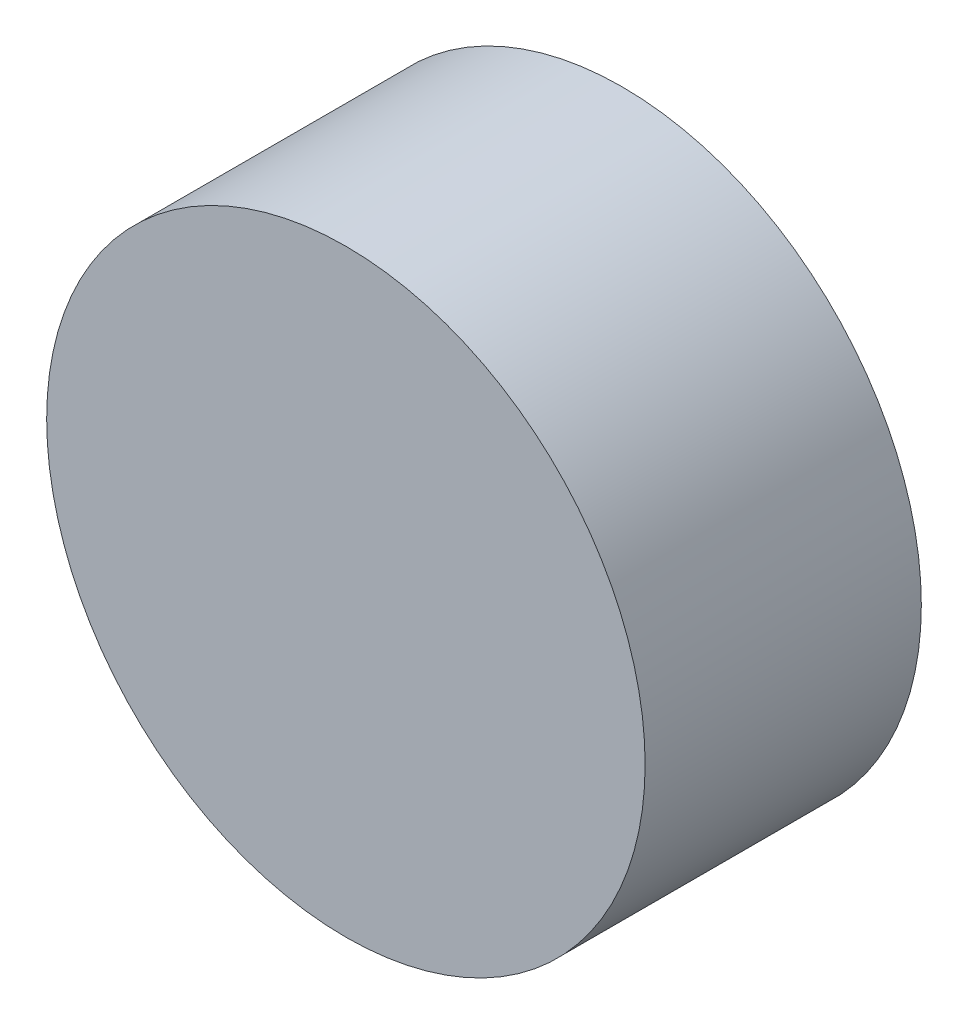
ISO-10303-21;
HEADER;
FILE_DESCRIPTION(('STEP AP214'),'2;1');
FILE_NAME('part.step','',(''),(''),'','','');
FILE_SCHEMA(('AUTOMOTIVE_DESIGN { 1 0 10303 214 1 1 1 1 }'));
ENDSEC;
DATA;
#1=APPLICATION_CONTEXT('core data for automotive mechanical design processes');
#2=APPLICATION_PROTOCOL_DEFINITION('international standard','automotive_design',2000,#1);
#3=PRODUCT_CONTEXT('',#1,'mechanical');
#4=PRODUCT('Part','Part','',(#3));
#5=PRODUCT_RELATED_PRODUCT_CATEGORY('part','',(#4));
#6=PRODUCT_DEFINITION_FORMATION('','',#4);
#7=PRODUCT_DEFINITION_CONTEXT('part definition',#1,'design');
#8=PRODUCT_DEFINITION('design','',#6,#7);
#9=PRODUCT_DEFINITION_SHAPE('','',#8);
#10=(LENGTH_UNIT() NAMED_UNIT(*) SI_UNIT(.MILLI.,.METRE.));
#11=(NAMED_UNIT(*) PLANE_ANGLE_UNIT() SI_UNIT($,.RADIAN.));
#12=(NAMED_UNIT(*) SI_UNIT($,.STERADIAN.) SOLID_ANGLE_UNIT());
#13=UNCERTAINTY_MEASURE_WITH_UNIT(LENGTH_MEASURE(1.E-05),#10,'distance_accuracy_value','');
#14=(GEOMETRIC_REPRESENTATION_CONTEXT(3) GLOBAL_UNCERTAINTY_ASSIGNED_CONTEXT((#13)) GLOBAL_UNIT_ASSIGNED_CONTEXT((#10,
#11,#12)) REPRESENTATION_CONTEXT('',''));
#15=CARTESIAN_POINT('',(0.,0.,0.));
#16=DIRECTION('',(0.,0.,1.));
#17=DIRECTION('',(1.,0.,0.));
#18=AXIS2_PLACEMENT_3D('',#15,#16,#17);
#19=CARTESIAN_POINT('',(0.,0.,12.));
#20=DIRECTION('',(0.,0.,-1.));
#21=DIRECTION('',(-1.,0.,0.));
#22=AXIS2_PLACEMENT_3D('',#19,#20,#21);
#23=CYLINDRICAL_SURFACE('',#22,13.);
#24=CARTESIAN_POINT('',(0.,0.,12.));
#25=DIRECTION('',(0.,0.,1.));
#26=DIRECTION('',(1.,0.,0.));
#27=AXIS2_PLACEMENT_3D('',#24,#25,#26);
#28=CIRCLE('',#27,13.);
#29=CARTESIAN_POINT('',(13.,0.,12.));
#30=VERTEX_POINT('',#29);
#31=EDGE_CURVE('E10',#30,#30,#28,.T.);
#32=ORIENTED_EDGE('',*,*,#31,.F.);
#33=EDGE_LOOP('',(#32));
#34=FACE_BOUND('',#33,.T.);
#35=CARTESIAN_POINT('',(0.,0.,0.));
#36=DIRECTION('',(0.,0.,1.));
#37=DIRECTION('',(1.,0.,0.));
#38=AXIS2_PLACEMENT_3D('',#35,#36,#37);
#39=CIRCLE('',#38,13.);
#40=CARTESIAN_POINT('',(13.,0.,0.));
#41=VERTEX_POINT('',#40);
#42=EDGE_CURVE('E40',#41,#41,#39,.T.);
#43=ORIENTED_EDGE('',*,*,#42,.T.);
#44=EDGE_LOOP('',(#43));
#45=FACE_BOUND('',#44,.T.);
#46=ADVANCED_FACE('F37',(#34,#45),#23,.T.);
#47=CARTESIAN_POINT('',(0.,0.,12.));
#48=DIRECTION('',(0.,0.,1.));
#49=DIRECTION('',(1.,0.,0.));
#50=AXIS2_PLACEMENT_3D('',#47,#48,#49);
#51=PLANE('',#50);
#52=ORIENTED_EDGE('',*,*,#31,.T.);
#53=EDGE_LOOP('',(#52));
#54=FACE_BOUND('',#53,.T.);
#55=ADVANCED_FACE('F52',(#54),#51,.T.);
#56=CARTESIAN_POINT('',(0.,0.,0.));
#57=DIRECTION('',(0.,0.,1.));
#58=DIRECTION('',(1.,0.,0.));
#59=AXIS2_PLACEMENT_3D('',#56,#57,#58);
#60=PLANE('',#59);
#61=ORIENTED_EDGE('',*,*,#42,.F.);
#62=EDGE_LOOP('',(#61));
#63=FACE_BOUND('',#62,.T.);
#64=ADVANCED_FACE('F50',(#63),#60,.F.);
#65=CLOSED_SHELL('',(#46,#55,#64));
#66=MANIFOLD_SOLID_BREP('B2',#65);
#67=ADVANCED_BREP_SHAPE_REPRESENTATION('',(#18,#66),#14);
#68=SHAPE_DEFINITION_REPRESENTATION(#9,#67);
ENDSEC;
END-ISO-10303-21;
